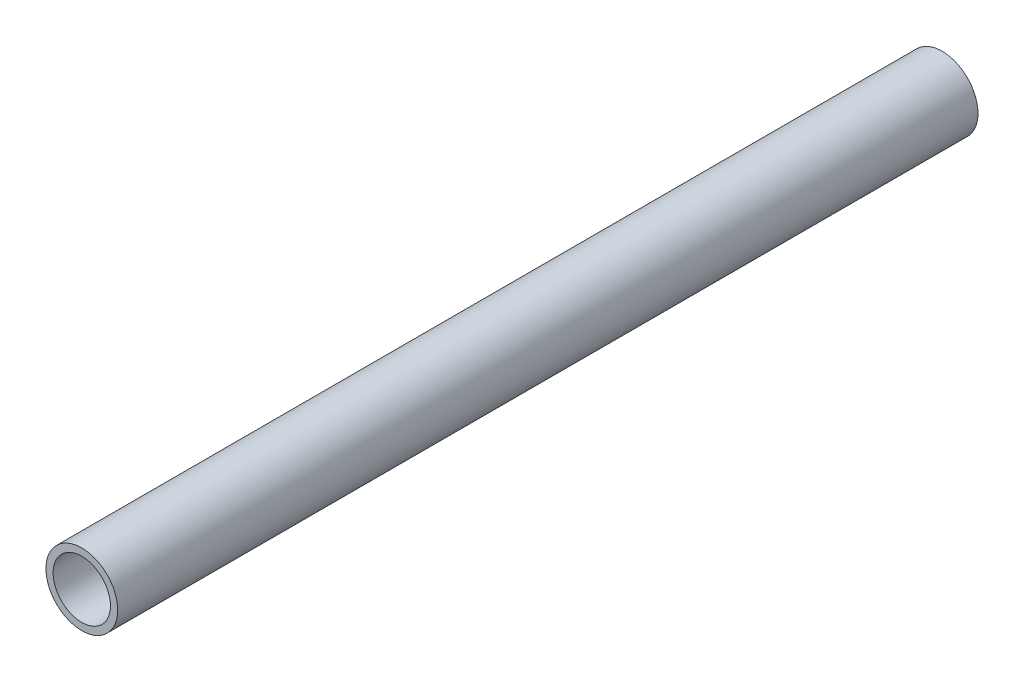
ISO-10303-21;
HEADER;
FILE_DESCRIPTION(('STEP AP214'),'2;1');
FILE_NAME('part.step','',(''),(''),'','','');
FILE_SCHEMA(('AUTOMOTIVE_DESIGN { 1 0 10303 214 1 1 1 1 }'));
ENDSEC;
DATA;
#1=APPLICATION_CONTEXT('core data for automotive mechanical design processes');
#2=APPLICATION_PROTOCOL_DEFINITION('international standard','automotive_design',2000,#1);
#3=PRODUCT_CONTEXT('',#1,'mechanical');
#4=PRODUCT('Part','Part','',(#3));
#5=PRODUCT_RELATED_PRODUCT_CATEGORY('part','',(#4));
#6=PRODUCT_DEFINITION_FORMATION('','',#4);
#7=PRODUCT_DEFINITION_CONTEXT('part definition',#1,'design');
#8=PRODUCT_DEFINITION('design','',#6,#7);
#9=PRODUCT_DEFINITION_SHAPE('','',#8);
#10=(LENGTH_UNIT() NAMED_UNIT(*) SI_UNIT(.MILLI.,.METRE.));
#11=(NAMED_UNIT(*) PLANE_ANGLE_UNIT() SI_UNIT($,.RADIAN.));
#12=(NAMED_UNIT(*) SI_UNIT($,.STERADIAN.) SOLID_ANGLE_UNIT());
#13=UNCERTAINTY_MEASURE_WITH_UNIT(LENGTH_MEASURE(1.E-05),#10,'distance_accuracy_value','');
#14=(GEOMETRIC_REPRESENTATION_CONTEXT(3) GLOBAL_UNCERTAINTY_ASSIGNED_CONTEXT((#13)) GLOBAL_UNIT_ASSIGNED_CONTEXT((#10,
#11,#12)) REPRESENTATION_CONTEXT('',''));
#15=CARTESIAN_POINT('',(0.,0.,0.));
#16=DIRECTION('',(0.,0.,1.));
#17=DIRECTION('',(1.,0.,0.));
#18=AXIS2_PLACEMENT_3D('',#15,#16,#17);
#19=CARTESIAN_POINT('',(0.,0.,600.));
#20=DIRECTION('',(0.,0.,-1.));
#21=DIRECTION('',(-1.,0.,0.));
#22=AXIS2_PLACEMENT_3D('',#19,#20,#21);
#23=CYLINDRICAL_SURFACE('',#22,25.);
#24=CARTESIAN_POINT('',(0.,0.,600.));
#25=DIRECTION('',(0.,0.,1.));
#26=DIRECTION('',(1.,0.,0.));
#27=AXIS2_PLACEMENT_3D('',#24,#25,#26);
#28=CIRCLE('',#27,25.);
#29=CARTESIAN_POINT('',(25.,0.,600.));
#30=VERTEX_POINT('',#29);
#31=EDGE_CURVE('E10',#30,#30,#28,.T.);
#32=ORIENTED_EDGE('',*,*,#31,.F.);
#33=EDGE_LOOP('',(#32));
#34=FACE_BOUND('',#33,.T.);
#35=CARTESIAN_POINT('',(0.,0.,0.));
#36=DIRECTION('',(0.,0.,1.));
#37=DIRECTION('',(1.,0.,0.));
#38=AXIS2_PLACEMENT_3D('',#35,#36,#37);
#39=CIRCLE('',#38,25.);
#40=CARTESIAN_POINT('',(25.,0.,0.));
#41=VERTEX_POINT('',#40);
#42=EDGE_CURVE('E34',#41,#41,#39,.T.);
#43=ORIENTED_EDGE('',*,*,#42,.T.);
#44=EDGE_LOOP('',(#43));
#45=FACE_BOUND('',#44,.T.);
#46=ADVANCED_FACE('F31',(#34,#45),#23,.T.);
#47=CARTESIAN_POINT('',(0.,0.,600.));
#48=DIRECTION('',(0.,0.,1.));
#49=DIRECTION('',(1.,0.,0.));
#50=AXIS2_PLACEMENT_3D('',#47,#48,#49);
#51=PLANE('',#50);
#52=CARTESIAN_POINT('',(0.,0.,600.));
#53=DIRECTION('',(0.,0.,1.));
#54=DIRECTION('',(1.,0.,0.));
#55=AXIS2_PLACEMENT_3D('',#52,#53,#54);
#56=CIRCLE('',#55,20.);
#57=CARTESIAN_POINT('',(20.,0.,600.));
#58=VERTEX_POINT('',#57);
#59=EDGE_CURVE('E43',#58,#58,#56,.T.);
#60=ORIENTED_EDGE('',*,*,#59,.F.);
#61=EDGE_LOOP('',(#60));
#62=FACE_BOUND('',#61,.T.);
#63=ORIENTED_EDGE('',*,*,#31,.T.);
#64=EDGE_LOOP('',(#63));
#65=FACE_BOUND('',#64,.T.);
#66=ADVANCED_FACE('F58',(#62,#65),#51,.T.);
#67=CARTESIAN_POINT('',(0.,0.,0.));
#68=DIRECTION('',(0.,0.,1.));
#69=DIRECTION('',(1.,0.,0.));
#70=AXIS2_PLACEMENT_3D('',#67,#68,#69);
#71=PLANE('',#70);
#72=CARTESIAN_POINT('',(0.,0.,0.));
#73=DIRECTION('',(0.,0.,1.));
#74=DIRECTION('',(1.,0.,0.));
#75=AXIS2_PLACEMENT_3D('',#72,#73,#74);
#76=CIRCLE('',#75,20.);
#77=CARTESIAN_POINT('',(20.,0.,0.));
#78=VERTEX_POINT('',#77);
#79=EDGE_CURVE('E41',#78,#78,#76,.T.);
#80=ORIENTED_EDGE('',*,*,#79,.T.);
#81=EDGE_LOOP('',(#80));
#82=FACE_BOUND('',#81,.T.);
#83=ORIENTED_EDGE('',*,*,#42,.F.);
#84=EDGE_LOOP('',(#83));
#85=FACE_BOUND('',#84,.T.);
#86=ADVANCED_FACE('F49',(#82,#85),#71,.F.);
#87=CARTESIAN_POINT('',(0.,0.,0.));
#88=DIRECTION('',(0.,0.,1.));
#89=DIRECTION('',(1.,0.,0.));
#90=AXIS2_PLACEMENT_3D('',#87,#88,#89);
#91=CYLINDRICAL_SURFACE('',#90,20.);
#92=ORIENTED_EDGE('',*,*,#79,.F.);
#93=EDGE_LOOP('',(#92));
#94=FACE_BOUND('',#93,.T.);
#95=ORIENTED_EDGE('',*,*,#59,.T.);
#96=EDGE_LOOP('',(#95));
#97=FACE_BOUND('',#96,.T.);
#98=ADVANCED_FACE('F52',(#94,#97),#91,.F.);
#99=CLOSED_SHELL('',(#46,#66,#86,#98));
#100=MANIFOLD_SOLID_BREP('B2',#99);
#101=ADVANCED_BREP_SHAPE_REPRESENTATION('',(#18,#100),#14);
#102=SHAPE_DEFINITION_REPRESENTATION(#9,#101);
ENDSEC;
END-ISO-10303-21;
